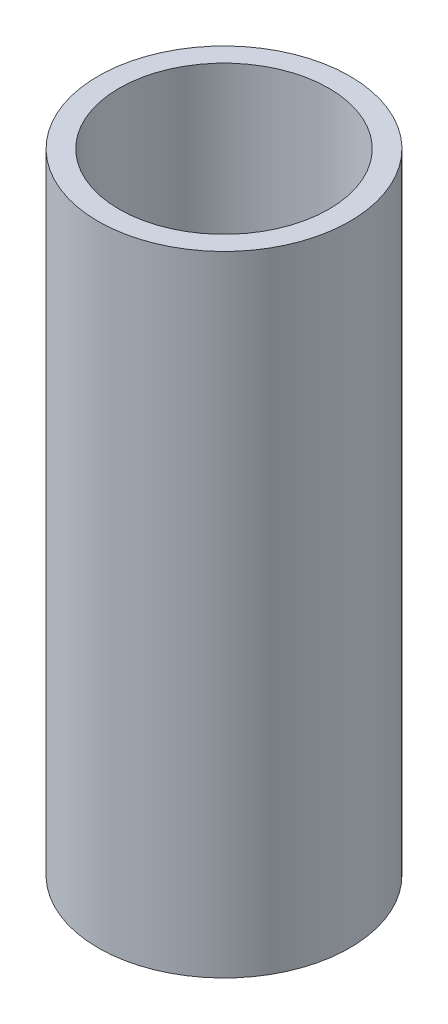
ISO-10303-21;
HEADER;
FILE_DESCRIPTION(('STEP AP214'),'2;1');
FILE_NAME('part.step','',(''),(''),'','','');
FILE_SCHEMA(('AUTOMOTIVE_DESIGN { 1 0 10303 214 1 1 1 1 }'));
ENDSEC;
DATA;
#1=APPLICATION_CONTEXT('core data for automotive mechanical design processes');
#2=APPLICATION_PROTOCOL_DEFINITION('international standard','automotive_design',2000,#1);
#3=PRODUCT_CONTEXT('',#1,'mechanical');
#4=PRODUCT('Part','Part','',(#3));
#5=PRODUCT_RELATED_PRODUCT_CATEGORY('part','',(#4));
#6=PRODUCT_DEFINITION_FORMATION('','',#4);
#7=PRODUCT_DEFINITION_CONTEXT('part definition',#1,'design');
#8=PRODUCT_DEFINITION('design','',#6,#7);
#9=PRODUCT_DEFINITION_SHAPE('','',#8);
#10=(LENGTH_UNIT() NAMED_UNIT(*) SI_UNIT(.MILLI.,.METRE.));
#11=(NAMED_UNIT(*) PLANE_ANGLE_UNIT() SI_UNIT($,.RADIAN.));
#12=(NAMED_UNIT(*) SI_UNIT($,.STERADIAN.) SOLID_ANGLE_UNIT());
#13=UNCERTAINTY_MEASURE_WITH_UNIT(LENGTH_MEASURE(1.E-05),#10,'distance_accuracy_value','');
#14=(GEOMETRIC_REPRESENTATION_CONTEXT(3) GLOBAL_UNCERTAINTY_ASSIGNED_CONTEXT((#13)) GLOBAL_UNIT_ASSIGNED_CONTEXT((#10,
#11,#12)) REPRESENTATION_CONTEXT('',''));
#15=CARTESIAN_POINT('',(0.,0.,0.));
#16=DIRECTION('',(0.,0.,1.));
#17=DIRECTION('',(1.,0.,0.));
#18=AXIS2_PLACEMENT_3D('',#15,#16,#17);
#19=CARTESIAN_POINT('',(0.,60.,0.));
#20=DIRECTION('',(0.,1.,0.));
#21=DIRECTION('',(0.,0.,1.));
#22=AXIS2_PLACEMENT_3D('',#19,#20,#21);
#23=PLANE('',#22);
#24=CARTESIAN_POINT('',(0.,60.,0.));
#25=DIRECTION('',(0.,1.,0.));
#26=DIRECTION('',(0.,0.,1.));
#27=AXIS2_PLACEMENT_3D('',#24,#25,#26);
#28=CIRCLE('',#27,12.);
#29=CARTESIAN_POINT('',(0.,60.,12.));
#30=VERTEX_POINT('',#29);
#31=EDGE_CURVE('E10',#30,#30,#28,.T.);
#32=ORIENTED_EDGE('',*,*,#31,.T.);
#33=EDGE_LOOP('',(#32));
#34=FACE_BOUND('',#33,.T.);
#35=CARTESIAN_POINT('',(0.,60.,0.));
#36=DIRECTION('',(0.,1.,0.));
#37=DIRECTION('',(0.,0.,1.));
#38=AXIS2_PLACEMENT_3D('',#35,#36,#37);
#39=CIRCLE('',#38,10.);
#40=CARTESIAN_POINT('',(0.,60.,10.));
#41=VERTEX_POINT('',#40);
#42=EDGE_CURVE('E45',#41,#41,#39,.T.);
#43=ORIENTED_EDGE('',*,*,#42,.F.);
#44=EDGE_LOOP('',(#43));
#45=FACE_BOUND('',#44,.T.);
#46=ADVANCED_FACE('F32',(#34,#45),#23,.T.);
#47=CARTESIAN_POINT('',(0.,0.,0.));
#48=DIRECTION('',(0.,1.,0.));
#49=DIRECTION('',(0.,0.,1.));
#50=AXIS2_PLACEMENT_3D('',#47,#48,#49);
#51=PLANE('',#50);
#52=CARTESIAN_POINT('',(0.,0.,0.));
#53=DIRECTION('',(0.,1.,0.));
#54=DIRECTION('',(0.,0.,1.));
#55=AXIS2_PLACEMENT_3D('',#52,#53,#54);
#56=CIRCLE('',#55,12.);
#57=CARTESIAN_POINT('',(0.,0.,12.));
#58=VERTEX_POINT('',#57);
#59=EDGE_CURVE('E36',#58,#58,#56,.T.);
#60=ORIENTED_EDGE('',*,*,#59,.F.);
#61=EDGE_LOOP('',(#60));
#62=FACE_BOUND('',#61,.T.);
#63=CARTESIAN_POINT('',(0.,0.,0.));
#64=DIRECTION('',(0.,1.,0.));
#65=DIRECTION('',(0.,0.,1.));
#66=AXIS2_PLACEMENT_3D('',#63,#64,#65);
#67=CIRCLE('',#66,10.);
#68=CARTESIAN_POINT('',(0.,0.,10.));
#69=VERTEX_POINT('',#68);
#70=EDGE_CURVE('E47',#69,#69,#67,.T.);
#71=ORIENTED_EDGE('',*,*,#70,.T.);
#72=EDGE_LOOP('',(#71));
#73=FACE_BOUND('',#72,.T.);
#74=ADVANCED_FACE('F57',(#62,#73),#51,.F.);
#75=CARTESIAN_POINT('',(0.,60.,0.));
#76=DIRECTION('',(0.,-1.,0.));
#77=DIRECTION('',(0.,0.,-1.));
#78=AXIS2_PLACEMENT_3D('',#75,#76,#77);
#79=CYLINDRICAL_SURFACE('',#78,12.);
#80=ORIENTED_EDGE('',*,*,#31,.F.);
#81=EDGE_LOOP('',(#80));
#82=FACE_BOUND('',#81,.T.);
#83=ORIENTED_EDGE('',*,*,#59,.T.);
#84=EDGE_LOOP('',(#83));
#85=FACE_BOUND('',#84,.T.);
#86=ADVANCED_FACE('F34',(#82,#85),#79,.T.);
#87=CARTESIAN_POINT('',(0.,60.,0.));
#88=DIRECTION('',(0.,-1.,0.));
#89=DIRECTION('',(0.,0.,-1.));
#90=AXIS2_PLACEMENT_3D('',#87,#88,#89);
#91=CYLINDRICAL_SURFACE('',#90,10.);
#92=ORIENTED_EDGE('',*,*,#42,.T.);
#93=EDGE_LOOP('',(#92));
#94=FACE_BOUND('',#93,.T.);
#95=ORIENTED_EDGE('',*,*,#70,.F.);
#96=EDGE_LOOP('',(#95));
#97=FACE_BOUND('',#96,.T.);
#98=ADVANCED_FACE('F53',(#94,#97),#91,.F.);
#99=CLOSED_SHELL('',(#46,#74,#86,#98));
#100=MANIFOLD_SOLID_BREP('B2',#99);
#101=ADVANCED_BREP_SHAPE_REPRESENTATION('',(#18,#100),#14);
#102=SHAPE_DEFINITION_REPRESENTATION(#9,#101);
ENDSEC;
END-ISO-10303-21;
